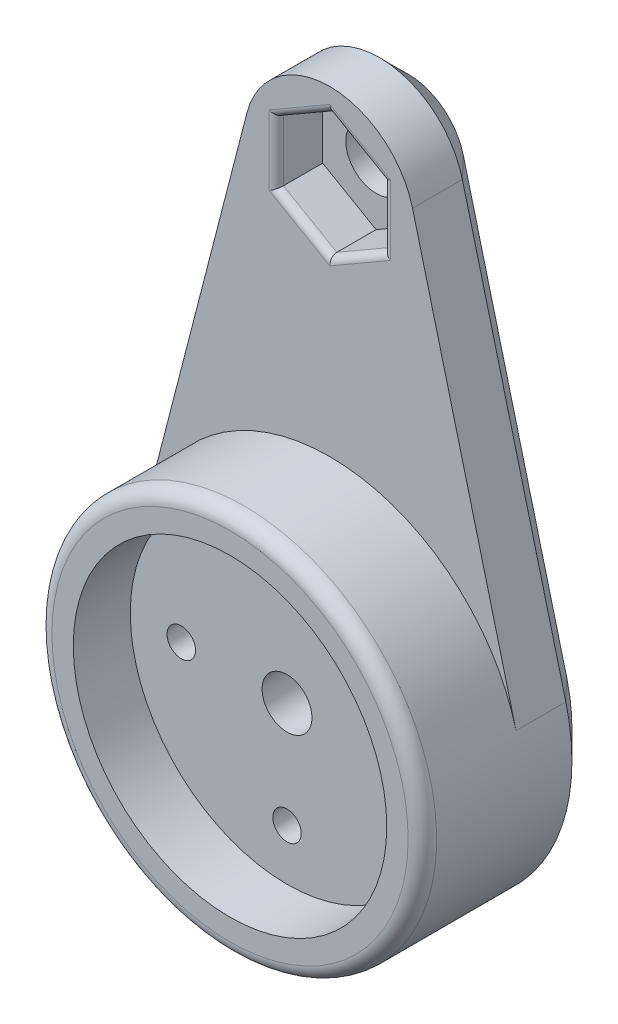
ISO-10303-21;
HEADER;
FILE_DESCRIPTION(('STEP AP214'),'2;1');
FILE_NAME('part.step','',(''),(''),'','','');
FILE_SCHEMA(('AUTOMOTIVE_DESIGN { 1 0 10303 214 1 1 1 1 }'));
ENDSEC;
DATA;
#1=APPLICATION_CONTEXT('core data for automotive mechanical design processes');
#2=APPLICATION_PROTOCOL_DEFINITION('international standard','automotive_design',2000,#1);
#3=PRODUCT_CONTEXT('',#1,'mechanical');
#4=PRODUCT('Part','Part','',(#3));
#5=PRODUCT_RELATED_PRODUCT_CATEGORY('part','',(#4));
#6=PRODUCT_DEFINITION_FORMATION('','',#4);
#7=PRODUCT_DEFINITION_CONTEXT('part definition',#1,'design');
#8=PRODUCT_DEFINITION('design','',#6,#7);
#9=PRODUCT_DEFINITION_SHAPE('','',#8);
#10=(LENGTH_UNIT() NAMED_UNIT(*) SI_UNIT(.MILLI.,.METRE.));
#11=(NAMED_UNIT(*) PLANE_ANGLE_UNIT() SI_UNIT($,.RADIAN.));
#12=(NAMED_UNIT(*) SI_UNIT($,.STERADIAN.) SOLID_ANGLE_UNIT());
#13=UNCERTAINTY_MEASURE_WITH_UNIT(LENGTH_MEASURE(1.E-05),#10,'distance_accuracy_value','');
#14=(GEOMETRIC_REPRESENTATION_CONTEXT(3) GLOBAL_UNCERTAINTY_ASSIGNED_CONTEXT((#13)) GLOBAL_UNIT_ASSIGNED_CONTEXT((#10,
#11,#12)) REPRESENTATION_CONTEXT('',''));
#15=CARTESIAN_POINT('',(0.,0.,0.));
#16=DIRECTION('',(0.,0.,1.));
#17=DIRECTION('',(1.,0.,0.));
#18=AXIS2_PLACEMENT_3D('',#15,#16,#17);
#19=CARTESIAN_POINT('',(0.,30.,-5.5));
#20=DIRECTION('',(0.,0.,1.));
#21=DIRECTION('',(-1.,0.,0.));
#22=AXIS2_PLACEMENT_3D('',#19,#20,#21);
#23=CYLINDRICAL_SURFACE('',#22,2.125);
#24=CARTESIAN_POINT('',(0.,30.,-6.));
#25=DIRECTION('',(0.,0.,1.));
#26=DIRECTION('',(1.,0.,0.));
#27=AXIS2_PLACEMENT_3D('',#24,#25,#26);
#28=CIRCLE('',#27,2.125);
#29=CARTESIAN_POINT('',(2.125,30.,-6.));
#30=VERTEX_POINT('',#29);
#31=EDGE_CURVE('E204',#30,#30,#28,.T.);
#32=ORIENTED_EDGE('',*,*,#31,.F.);
#33=EDGE_LOOP('',(#32));
#34=FACE_BOUND('',#33,.T.);
#35=CARTESIAN_POINT('',(0.,30.,-3.25));
#36=DIRECTION('',(0.,0.,-1.));
#37=DIRECTION('',(-1.,0.,0.));
#38=AXIS2_PLACEMENT_3D('',#35,#36,#37);
#39=CIRCLE('',#38,2.125);
#40=CARTESIAN_POINT('',(-2.125,30.,-3.25));
#41=VERTEX_POINT('',#40);
#42=EDGE_CURVE('E193',#41,#41,#39,.T.);
#43=ORIENTED_EDGE('',*,*,#42,.F.);
#44=EDGE_LOOP('',(#43));
#45=FACE_BOUND('',#44,.T.);
#46=ADVANCED_FACE('F47',(#34,#45),#23,.F.);
#47=CARTESIAN_POINT('',(0.,0.,-5.5));
#48=DIRECTION('',(0.,0.,-1.));
#49=DIRECTION('',(1.,0.,0.));
#50=AXIS2_PLACEMENT_3D('',#47,#48,#49);
#51=PLANE('',#50);
#52=CARTESIAN_POINT('',(0.,-7.42,-5.5));
#53=DIRECTION('',(0.,0.,-1.));
#54=DIRECTION('',(-1.,0.,0.));
#55=AXIS2_PLACEMENT_3D('',#52,#53,#54);
#56=CIRCLE('',#55,1.);
#57=CARTESIAN_POINT('',(-1.,-7.42,-5.5));
#58=VERTEX_POINT('',#57);
#59=EDGE_CURVE('E231',#58,#58,#56,.T.);
#60=ORIENTED_EDGE('',*,*,#59,.F.);
#61=EDGE_LOOP('',(#60));
#62=FACE_BOUND('',#61,.T.);
#63=CARTESIAN_POINT('',(7.42,0.,-5.5));
#64=DIRECTION('',(0.,0.,-1.));
#65=DIRECTION('',(-1.,0.,0.));
#66=AXIS2_PLACEMENT_3D('',#63,#64,#65);
#67=CIRCLE('',#66,1.);
#68=CARTESIAN_POINT('',(6.42,0.,-5.5));
#69=VERTEX_POINT('',#68);
#70=EDGE_CURVE('E232',#69,#69,#67,.T.);
#71=ORIENTED_EDGE('',*,*,#70,.F.);
#72=EDGE_LOOP('',(#71));
#73=FACE_BOUND('',#72,.T.);
#74=CARTESIAN_POINT('',(0.,7.42,-5.5));
#75=DIRECTION('',(0.,0.,-1.));
#76=DIRECTION('',(-1.,0.,0.));
#77=AXIS2_PLACEMENT_3D('',#74,#75,#76);
#78=CIRCLE('',#77,1.);
#79=CARTESIAN_POINT('',(-0.999999999999999,7.42,-5.5));
#80=VERTEX_POINT('',#79);
#81=EDGE_CURVE('E238',#80,#80,#78,.T.);
#82=ORIENTED_EDGE('',*,*,#81,.F.);
#83=EDGE_LOOP('',(#82));
#84=FACE_BOUND('',#83,.T.);
#85=CARTESIAN_POINT('',(-7.42,0.,-5.5));
#86=DIRECTION('',(0.,0.,-1.));
#87=DIRECTION('',(-1.,0.,0.));
#88=AXIS2_PLACEMENT_3D('',#85,#86,#87);
#89=CIRCLE('',#88,1.);
#90=CARTESIAN_POINT('',(-8.42,0.,-5.5));
#91=VERTEX_POINT('',#90);
#92=EDGE_CURVE('E220',#91,#91,#89,.T.);
#93=ORIENTED_EDGE('',*,*,#92,.F.);
#94=EDGE_LOOP('',(#93));
#95=FACE_BOUND('',#94,.T.);
#96=DIRECTION('',(-0.25,-0.968245836551854,0.));
#97=VECTOR('',#96,1.);
#98=CARTESIAN_POINT('',(-11.1348271203463,2.875,-5.5));
#99=LINE('',#98,#97);
#100=CARTESIAN_POINT('',(-3.87298334620741,31.,-5.5));
#101=VERTEX_POINT('',#100);
#102=CARTESIAN_POINT('',(-11.1348271203463,2.875,-5.5));
#103=VERTEX_POINT('',#102);
#104=EDGE_CURVE('E280',#101,#103,#99,.T.);
#105=ORIENTED_EDGE('',*,*,#104,.F.);
#106=CARTESIAN_POINT('',(0.,30.,-5.5));
#107=DIRECTION('',(0.,0.,1.));
#108=DIRECTION('',(1.,0.,0.));
#109=AXIS2_PLACEMENT_3D('',#106,#107,#108);
#110=CIRCLE('',#109,4.);
#111=CARTESIAN_POINT('',(3.87298334620741,31.,-5.5));
#112=VERTEX_POINT('',#111);
#113=EDGE_CURVE('E277',#112,#101,#110,.T.);
#114=ORIENTED_EDGE('',*,*,#113,.F.);
#115=DIRECTION('',(-0.25,0.968245836551854,0.));
#116=VECTOR('',#115,1.);
#117=CARTESIAN_POINT('',(11.1348271203463,2.875,-5.5));
#118=LINE('',#117,#116);
#119=CARTESIAN_POINT('',(11.1348271203463,2.875,-5.5));
#120=VERTEX_POINT('',#119);
#121=EDGE_CURVE('E274',#120,#112,#118,.T.);
#122=ORIENTED_EDGE('',*,*,#121,.F.);
#123=CARTESIAN_POINT('',(0.,0.,-5.5));
#124=DIRECTION('',(0.,0.,1.));
#125=DIRECTION('',(1.,0.,0.));
#126=AXIS2_PLACEMENT_3D('',#123,#124,#125);
#127=CIRCLE('',#126,11.5);
#128=EDGE_CURVE('E283',#103,#120,#127,.T.);
#129=ORIENTED_EDGE('',*,*,#128,.F.);
#130=EDGE_LOOP('',(#105,#114,#122,#129));
#131=FACE_BOUND('',#130,.T.);
#132=CARTESIAN_POINT('',(0.,0.,-5.5));
#133=DIRECTION('',(0.,0.,1.));
#134=DIRECTION('',(1.,0.,0.));
#135=AXIS2_PLACEMENT_3D('',#132,#133,#134);
#136=CIRCLE('',#135,3.);
#137=CARTESIAN_POINT('',(3.,0.,-5.5));
#138=VERTEX_POINT('',#137);
#139=EDGE_CURVE('E211',#138,#138,#136,.T.);
#140=ORIENTED_EDGE('',*,*,#139,.T.);
#141=EDGE_LOOP('',(#140));
#142=FACE_BOUND('',#141,.T.);
#143=CARTESIAN_POINT('',(0.,30.,-5.5));
#144=DIRECTION('',(0.,0.,1.));
#145=DIRECTION('',(1.,0.,0.));
#146=AXIS2_PLACEMENT_3D('',#143,#144,#145);
#147=CIRCLE('',#146,3.);
#148=CARTESIAN_POINT('',(3.,30.,-5.5));
#149=VERTEX_POINT('',#148);
#150=EDGE_CURVE('E207',#149,#149,#147,.T.);
#151=ORIENTED_EDGE('',*,*,#150,.T.);
#152=EDGE_LOOP('',(#151));
#153=FACE_BOUND('',#152,.T.);
#154=ADVANCED_FACE('F416',(#62,#73,#84,#95,#131,#142,#153),#51,.T.);
#155=CARTESIAN_POINT('',(0.,0.,-5.5));
#156=DIRECTION('',(0.,0.,1.));
#157=DIRECTION('',(-1.,0.,0.));
#158=AXIS2_PLACEMENT_3D('',#155,#156,#157);
#159=CYLINDRICAL_SURFACE('',#158,1.75);
#160=CARTESIAN_POINT('',(0.,0.,3.));
#161=DIRECTION('',(0.,0.,-1.));
#162=DIRECTION('',(-1.,0.,0.));
#163=AXIS2_PLACEMENT_3D('',#160,#161,#162);
#164=CIRCLE('',#163,1.75);
#165=CARTESIAN_POINT('',(-1.75,0.,3.));
#166=VERTEX_POINT('',#165);
#167=EDGE_CURVE('E227',#166,#166,#164,.T.);
#168=ORIENTED_EDGE('',*,*,#167,.F.);
#169=EDGE_LOOP('',(#168));
#170=FACE_BOUND('',#169,.T.);
#171=CARTESIAN_POINT('',(0.,0.,-2.5));
#172=DIRECTION('',(0.,0.,1.));
#173=DIRECTION('',(1.,0.,0.));
#174=AXIS2_PLACEMENT_3D('',#171,#172,#173);
#175=CIRCLE('',#174,1.75);
#176=CARTESIAN_POINT('',(1.75,0.,-2.5));
#177=VERTEX_POINT('',#176);
#178=EDGE_CURVE('E217',#177,#177,#175,.F.);
#179=ORIENTED_EDGE('',*,*,#178,.T.);
#180=EDGE_LOOP('',(#179));
#181=FACE_BOUND('',#180,.T.);
#182=ADVANCED_FACE('F382',(#170,#181),#159,.F.);
#183=CARTESIAN_POINT('',(0.,0.,0.));
#184=DIRECTION('',(0.,0.,-1.));
#185=DIRECTION('',(1.,0.,0.));
#186=AXIS2_PLACEMENT_3D('',#183,#184,#185);
#187=PLANE('',#186);
#188=DIRECTION('',(-0.866025403784439,-0.5,0.));
#189=VECTOR('',#188,1.);
#190=CARTESIAN_POINT('',(-10.8653810567666,18.8193920339161,0.));
#191=LINE('',#190,#189);
#192=CARTESIAN_POINT('',(0.,25.0925227118882,0.));
#193=VERTEX_POINT('',#192);
#194=CARTESIAN_POINT('',(4.25,27.5462613559441,0.));
#195=VERTEX_POINT('',#194);
#196=EDGE_CURVE('E328',#193,#195,#191,.F.);
#197=ORIENTED_EDGE('',*,*,#196,.F.);
#198=DIRECTION('',(-0.866025403784438,0.5,0.));
#199=VECTOR('',#198,1.);
#200=CARTESIAN_POINT('',(10.8653810567666,18.8193920339161,0.));
#201=LINE('',#200,#199);
#202=CARTESIAN_POINT('',(-4.25,27.5462613559441,0.));
#203=VERTEX_POINT('',#202);
#204=EDGE_CURVE('E325',#203,#193,#201,.F.);
#205=ORIENTED_EDGE('',*,*,#204,.F.);
#206=DIRECTION('',(0.,1.,0.));
#207=VECTOR('',#206,1.);
#208=CARTESIAN_POINT('',(-4.25,0.,0.));
#209=LINE('',#208,#207);
#210=CARTESIAN_POINT('',(-4.25,32.4537386440559,0.));
#211=VERTEX_POINT('',#210);
#212=EDGE_CURVE('E322',#211,#203,#209,.F.);
#213=ORIENTED_EDGE('',*,*,#212,.F.);
#214=DIRECTION('',(0.866025403784439,0.5,0.));
#215=VECTOR('',#214,1.);
#216=CARTESIAN_POINT('',(-15.1153810567666,26.1806079660839,0.));
#217=LINE('',#216,#215);
#218=CARTESIAN_POINT('',(0.,34.9074772881118,0.));
#219=VERTEX_POINT('',#218);
#220=EDGE_CURVE('E320',#219,#211,#217,.F.);
#221=ORIENTED_EDGE('',*,*,#220,.F.);
#222=DIRECTION('',(0.866025403784439,-0.5,0.));
#223=VECTOR('',#222,1.);
#224=CARTESIAN_POINT('',(15.1153810567666,26.1806079660839,0.));
#225=LINE('',#224,#223);
#226=CARTESIAN_POINT('',(4.25,32.4537386440559,0.));
#227=VERTEX_POINT('',#226);
#228=EDGE_CURVE('E318',#227,#219,#225,.F.);
#229=ORIENTED_EDGE('',*,*,#228,.F.);
#230=DIRECTION('',(0.,-1.,0.));
#231=VECTOR('',#230,1.);
#232=CARTESIAN_POINT('',(4.24999999999999,0.,0.));
#233=LINE('',#232,#231);
#234=EDGE_CURVE('E331',#195,#227,#233,.F.);
#235=ORIENTED_EDGE('',*,*,#234,.F.);
#236=EDGE_LOOP('',(#197,#205,#213,#221,#229,#235));
#237=FACE_BOUND('',#236,.T.);
#238=CARTESIAN_POINT('',(0.,0.,0.));
#239=DIRECTION('',(0.,0.,-1.));
#240=DIRECTION('',(-1.,0.,0.));
#241=AXIS2_PLACEMENT_3D('',#238,#239,#240);
#242=CIRCLE('',#241,13.5);
#243=CARTESIAN_POINT('',(-13.07131879345,3.375,0.));
#244=VERTEX_POINT('',#243);
#245=CARTESIAN_POINT('',(13.07131879345,3.375,0.));
#246=VERTEX_POINT('',#245);
#247=EDGE_CURVE('E252',#244,#246,#242,.T.);
#248=ORIENTED_EDGE('',*,*,#247,.T.);
#249=DIRECTION('',(0.25,-0.968245836551854,0.));
#250=VECTOR('',#249,1.);
#251=CARTESIAN_POINT('',(13.07131879345,3.375,0.));
#252=LINE('',#251,#250);
#253=CARTESIAN_POINT('',(5.80947501931113,31.5,0.));
#254=VERTEX_POINT('',#253);
#255=EDGE_CURVE('E257',#254,#246,#252,.T.);
#256=ORIENTED_EDGE('',*,*,#255,.F.);
#257=CARTESIAN_POINT('',(0.,30.,0.));
#258=DIRECTION('',(0.,0.,1.));
#259=DIRECTION('',(1.,0.,0.));
#260=AXIS2_PLACEMENT_3D('',#257,#258,#259);
#261=CIRCLE('',#260,6.);
#262=CARTESIAN_POINT('',(-5.80947501931113,31.5,0.));
#263=VERTEX_POINT('',#262);
#264=EDGE_CURVE('E260',#254,#263,#261,.T.);
#265=ORIENTED_EDGE('',*,*,#264,.T.);
#266=DIRECTION('',(0.25,0.968245836551854,0.));
#267=VECTOR('',#266,1.);
#268=CARTESIAN_POINT('',(-13.07131879345,3.375,0.));
#269=LINE('',#268,#267);
#270=EDGE_CURVE('E263',#244,#263,#269,.T.);
#271=ORIENTED_EDGE('',*,*,#270,.F.);
#272=EDGE_LOOP('',(#248,#256,#265,#271));
#273=FACE_BOUND('',#272,.T.);
#274=ADVANCED_FACE('F376',(#237,#273),#187,.F.);
#275=CARTESIAN_POINT('',(13.07131879345,3.375,-5.5));
#276=DIRECTION('',(0.968245836551854,0.25,0.));
#277=DIRECTION('',(-0.25,0.968245836551854,0.));
#278=AXIS2_PLACEMENT_3D('',#275,#276,#277);
#279=PLANE('',#278);
#280=DIRECTION('',(0.,0.,1.));
#281=VECTOR('',#280,1.);
#282=CARTESIAN_POINT('',(5.80947501931113,31.5,-5.5));
#283=LINE('',#282,#281);
#284=CARTESIAN_POINT('',(5.80947501931113,31.5,-3.5));
#285=VERTEX_POINT('',#284);
#286=EDGE_CURVE('E272',#285,#254,#283,.T.);
#287=ORIENTED_EDGE('',*,*,#286,.T.);
#288=ORIENTED_EDGE('',*,*,#255,.T.);
#289=DIRECTION('',(0.,0.,1.));
#290=VECTOR('',#289,1.);
#291=CARTESIAN_POINT('',(13.07131879345,3.375,-5.5));
#292=LINE('',#291,#290);
#293=CARTESIAN_POINT('',(13.07131879345,3.375,-3.5));
#294=VERTEX_POINT('',#293);
#295=EDGE_CURVE('E266',#294,#246,#292,.T.);
#296=ORIENTED_EDGE('',*,*,#295,.F.);
#297=DIRECTION('',(0.25,-0.968245836551854,0.));
#298=VECTOR('',#297,1.);
#299=CARTESIAN_POINT('',(13.07131879345,3.375,-3.5));
#300=LINE('',#299,#298);
#301=EDGE_CURVE('E295',#285,#294,#300,.T.);
#302=ORIENTED_EDGE('',*,*,#301,.F.);
#303=EDGE_LOOP('',(#287,#288,#296,#302));
#304=FACE_BOUND('',#303,.T.);
#305=ADVANCED_FACE('F381',(#304),#279,.T.);
#306=CARTESIAN_POINT('',(0.,30.,-5.5));
#307=DIRECTION('',(0.,0.,1.));
#308=DIRECTION('',(-1.,0.,0.));
#309=AXIS2_PLACEMENT_3D('',#306,#307,#308);
#310=CYLINDRICAL_SURFACE('',#309,6.);
#311=DIRECTION('',(0.,0.,1.));
#312=VECTOR('',#311,1.);
#313=CARTESIAN_POINT('',(-5.80947501931113,31.5,-5.5));
#314=LINE('',#313,#312);
#315=CARTESIAN_POINT('',(-5.80947501931113,31.5,-3.5));
#316=VERTEX_POINT('',#315);
#317=EDGE_CURVE('E270',#316,#263,#314,.T.);
#318=ORIENTED_EDGE('',*,*,#317,.T.);
#319=ORIENTED_EDGE('',*,*,#264,.F.);
#320=ORIENTED_EDGE('',*,*,#286,.F.);
#321=CARTESIAN_POINT('',(0.,30.,-3.5));
#322=DIRECTION('',(0.,0.,1.));
#323=DIRECTION('',(1.,0.,0.));
#324=AXIS2_PLACEMENT_3D('',#321,#322,#323);
#325=CIRCLE('',#324,6.);
#326=EDGE_CURVE('E292',#316,#285,#325,.F.);
#327=ORIENTED_EDGE('',*,*,#326,.F.);
#328=EDGE_LOOP('',(#318,#319,#320,#327));
#329=FACE_BOUND('',#328,.T.);
#330=ADVANCED_FACE('F398',(#329),#310,.T.);
#331=CARTESIAN_POINT('',(-13.07131879345,3.375,-5.5));
#332=DIRECTION('',(-0.968245836551854,0.25,0.));
#333=DIRECTION('',(-0.25,-0.968245836551854,0.));
#334=AXIS2_PLACEMENT_3D('',#331,#332,#333);
#335=PLANE('',#334);
#336=DIRECTION('',(0.,0.,1.));
#337=VECTOR('',#336,1.);
#338=CARTESIAN_POINT('',(-13.07131879345,3.375,-5.5));
#339=LINE('',#338,#337);
#340=CARTESIAN_POINT('',(-13.07131879345,3.375,-3.5));
#341=VERTEX_POINT('',#340);
#342=EDGE_CURVE('E268',#341,#244,#339,.T.);
#343=ORIENTED_EDGE('',*,*,#342,.T.);
#344=ORIENTED_EDGE('',*,*,#270,.T.);
#345=ORIENTED_EDGE('',*,*,#317,.F.);
#346=DIRECTION('',(0.25,0.968245836551854,0.));
#347=VECTOR('',#346,1.);
#348=CARTESIAN_POINT('',(-13.07131879345,3.375,-3.5));
#349=LINE('',#348,#347);
#350=EDGE_CURVE('E289',#341,#316,#349,.T.);
#351=ORIENTED_EDGE('',*,*,#350,.F.);
#352=EDGE_LOOP('',(#343,#344,#345,#351));
#353=FACE_BOUND('',#352,.T.);
#354=ADVANCED_FACE('F402',(#353),#335,.T.);
#355=CARTESIAN_POINT('',(0.,0.,-5.5));
#356=DIRECTION('',(0.,0.,1.));
#357=DIRECTION('',(-1.,0.,0.));
#358=AXIS2_PLACEMENT_3D('',#355,#356,#357);
#359=CYLINDRICAL_SURFACE('',#358,13.5);
#360=CARTESIAN_POINT('',(0.,0.,6.));
#361=DIRECTION('',(0.,0.,-1.));
#362=DIRECTION('',(-1.,0.,0.));
#363=AXIS2_PLACEMENT_3D('',#360,#361,#362);
#364=CIRCLE('',#363,13.5);
#365=CARTESIAN_POINT('',(-13.5,0.,6.));
#366=VERTEX_POINT('',#365);
#367=EDGE_CURVE('E310',#366,#366,#364,.F.);
#368=ORIENTED_EDGE('',*,*,#367,.F.);
#369=EDGE_LOOP('',(#368));
#370=FACE_BOUND('',#369,.T.);
#371=ORIENTED_EDGE('',*,*,#295,.T.);
#372=ORIENTED_EDGE('',*,*,#247,.F.);
#373=ORIENTED_EDGE('',*,*,#342,.F.);
#374=CARTESIAN_POINT('',(0.,0.,-3.5));
#375=DIRECTION('',(0.,0.,1.));
#376=DIRECTION('',(1.,0.,0.));
#377=AXIS2_PLACEMENT_3D('',#374,#375,#376);
#378=CIRCLE('',#377,13.5);
#379=EDGE_CURVE('E286',#294,#341,#378,.F.);
#380=ORIENTED_EDGE('',*,*,#379,.F.);
#381=EDGE_LOOP('',(#371,#372,#373,#380));
#382=FACE_BOUND('',#381,.T.);
#383=ADVANCED_FACE('F389',(#370,#382),#359,.T.);
#384=CARTESIAN_POINT('',(0.,0.,7.));
#385=DIRECTION('',(0.,0.,1.));
#386=DIRECTION('',(-1.,0.,0.));
#387=AXIS2_PLACEMENT_3D('',#384,#385,#386);
#388=PLANE('',#387);
#389=CARTESIAN_POINT('',(0.,0.,7.));
#390=DIRECTION('',(0.,0.,-1.));
#391=DIRECTION('',(-1.,0.,0.));
#392=AXIS2_PLACEMENT_3D('',#389,#390,#391);
#393=CIRCLE('',#392,12.5);
#394=CARTESIAN_POINT('',(-12.5,0.,7.));
#395=VERTEX_POINT('',#394);
#396=EDGE_CURVE('E298',#395,#395,#393,.T.);
#397=ORIENTED_EDGE('',*,*,#396,.F.);
#398=EDGE_LOOP('',(#397));
#399=FACE_BOUND('',#398,.T.);
#400=CARTESIAN_POINT('',(0.,0.,7.));
#401=DIRECTION('',(0.,0.,-1.));
#402=DIRECTION('',(-1.,0.,0.));
#403=AXIS2_PLACEMENT_3D('',#400,#401,#402);
#404=CIRCLE('',#403,11.);
#405=CARTESIAN_POINT('',(-11.,0.,7.));
#406=VERTEX_POINT('',#405);
#407=EDGE_CURVE('E223',#406,#406,#404,.T.);
#408=ORIENTED_EDGE('',*,*,#407,.T.);
#409=EDGE_LOOP('',(#408));
#410=FACE_BOUND('',#409,.T.);
#411=ADVANCED_FACE('F547',(#399,#410),#388,.T.);
#412=CARTESIAN_POINT('',(0.,0.,3.));
#413=DIRECTION('',(0.,0.,1.));
#414=DIRECTION('',(-1.,0.,0.));
#415=AXIS2_PLACEMENT_3D('',#412,#413,#414);
#416=CYLINDRICAL_SURFACE('',#415,11.);
#417=CARTESIAN_POINT('',(0.,0.,3.));
#418=DIRECTION('',(0.,0.,-1.));
#419=DIRECTION('',(-1.,0.,0.));
#420=AXIS2_PLACEMENT_3D('',#417,#418,#419);
#421=CIRCLE('',#420,11.);
#422=CARTESIAN_POINT('',(-11.,0.,3.));
#423=VERTEX_POINT('',#422);
#424=EDGE_CURVE('E249',#423,#423,#421,.T.);
#425=ORIENTED_EDGE('',*,*,#424,.T.);
#426=EDGE_LOOP('',(#425));
#427=FACE_BOUND('',#426,.T.);
#428=ORIENTED_EDGE('',*,*,#407,.F.);
#429=EDGE_LOOP('',(#428));
#430=FACE_BOUND('',#429,.T.);
#431=ADVANCED_FACE('F541',(#427,#430),#416,.F.);
#432=CARTESIAN_POINT('',(0.,0.,3.));
#433=DIRECTION('',(0.,0.,1.));
#434=DIRECTION('',(-1.,0.,0.));
#435=AXIS2_PLACEMENT_3D('',#432,#433,#434);
#436=PLANE('',#435);
#437=ORIENTED_EDGE('',*,*,#167,.T.);
#438=EDGE_LOOP('',(#437));
#439=FACE_BOUND('',#438,.T.);
#440=CARTESIAN_POINT('',(-7.42,0.,3.));
#441=DIRECTION('',(0.,0.,-1.));
#442=DIRECTION('',(-1.,0.,0.));
#443=AXIS2_PLACEMENT_3D('',#440,#441,#442);
#444=CIRCLE('',#443,1.);
#445=CARTESIAN_POINT('',(-8.42,0.,3.));
#446=VERTEX_POINT('',#445);
#447=EDGE_CURVE('E224',#446,#446,#444,.T.);
#448=ORIENTED_EDGE('',*,*,#447,.T.);
#449=EDGE_LOOP('',(#448));
#450=FACE_BOUND('',#449,.T.);
#451=CARTESIAN_POINT('',(0.,7.42,3.));
#452=DIRECTION('',(0.,0.,-1.));
#453=DIRECTION('',(-1.,0.,0.));
#454=AXIS2_PLACEMENT_3D('',#451,#452,#453);
#455=CIRCLE('',#454,1.);
#456=CARTESIAN_POINT('',(-0.999999999999999,7.42,3.));
#457=VERTEX_POINT('',#456);
#458=EDGE_CURVE('E235',#457,#457,#455,.T.);
#459=ORIENTED_EDGE('',*,*,#458,.T.);
#460=EDGE_LOOP('',(#459));
#461=FACE_BOUND('',#460,.T.);
#462=CARTESIAN_POINT('',(7.42,0.,3.));
#463=DIRECTION('',(0.,0.,-1.));
#464=DIRECTION('',(-1.,0.,0.));
#465=AXIS2_PLACEMENT_3D('',#462,#463,#464);
#466=CIRCLE('',#465,1.);
#467=CARTESIAN_POINT('',(6.42,0.,3.));
#468=VERTEX_POINT('',#467);
#469=EDGE_CURVE('E228',#468,#468,#466,.T.);
#470=ORIENTED_EDGE('',*,*,#469,.T.);
#471=EDGE_LOOP('',(#470));
#472=FACE_BOUND('',#471,.T.);
#473=CARTESIAN_POINT('',(0.,-7.42,3.));
#474=DIRECTION('',(0.,0.,-1.));
#475=DIRECTION('',(-1.,0.,0.));
#476=AXIS2_PLACEMENT_3D('',#473,#474,#475);
#477=CIRCLE('',#476,1.);
#478=CARTESIAN_POINT('',(-1.,-7.42,3.));
#479=VERTEX_POINT('',#478);
#480=EDGE_CURVE('E244',#479,#479,#477,.T.);
#481=ORIENTED_EDGE('',*,*,#480,.T.);
#482=EDGE_LOOP('',(#481));
#483=FACE_BOUND('',#482,.T.);
#484=ORIENTED_EDGE('',*,*,#424,.F.);
#485=EDGE_LOOP('',(#484));
#486=FACE_BOUND('',#485,.T.);
#487=ADVANCED_FACE('F546',(#439,#450,#461,#472,#483,#486),#436,.T.);
#488=CARTESIAN_POINT('',(0.,-7.42,-5.5));
#489=DIRECTION('',(0.,0.,1.));
#490=DIRECTION('',(-1.,0.,0.));
#491=AXIS2_PLACEMENT_3D('',#488,#489,#490);
#492=CYLINDRICAL_SURFACE('',#491,1.);
#493=ORIENTED_EDGE('',*,*,#59,.T.);
#494=EDGE_LOOP('',(#493));
#495=FACE_BOUND('',#494,.T.);
#496=ORIENTED_EDGE('',*,*,#480,.F.);
#497=EDGE_LOOP('',(#496));
#498=FACE_BOUND('',#497,.T.);
#499=ADVANCED_FACE('F557',(#495,#498),#492,.F.);
#500=CARTESIAN_POINT('',(7.42,0.,-5.5));
#501=DIRECTION('',(0.,0.,1.));
#502=DIRECTION('',(-1.,0.,0.));
#503=AXIS2_PLACEMENT_3D('',#500,#501,#502);
#504=CYLINDRICAL_SURFACE('',#503,1.);
#505=ORIENTED_EDGE('',*,*,#70,.T.);
#506=EDGE_LOOP('',(#505));
#507=FACE_BOUND('',#506,.T.);
#508=ORIENTED_EDGE('',*,*,#469,.F.);
#509=EDGE_LOOP('',(#508));
#510=FACE_BOUND('',#509,.T.);
#511=ADVANCED_FACE('F566',(#507,#510),#504,.F.);
#512=CARTESIAN_POINT('',(0.,7.42,-5.5));
#513=DIRECTION('',(0.,0.,1.));
#514=DIRECTION('',(-1.,0.,0.));
#515=AXIS2_PLACEMENT_3D('',#512,#513,#514);
#516=CYLINDRICAL_SURFACE('',#515,1.);
#517=ORIENTED_EDGE('',*,*,#81,.T.);
#518=EDGE_LOOP('',(#517));
#519=FACE_BOUND('',#518,.T.);
#520=ORIENTED_EDGE('',*,*,#458,.F.);
#521=EDGE_LOOP('',(#520));
#522=FACE_BOUND('',#521,.T.);
#523=ADVANCED_FACE('F575',(#519,#522),#516,.F.);
#524=CARTESIAN_POINT('',(-7.42,0.,-5.5));
#525=DIRECTION('',(0.,0.,1.));
#526=DIRECTION('',(-1.,0.,0.));
#527=AXIS2_PLACEMENT_3D('',#524,#525,#526);
#528=CYLINDRICAL_SURFACE('',#527,1.);
#529=ORIENTED_EDGE('',*,*,#92,.T.);
#530=EDGE_LOOP('',(#529));
#531=FACE_BOUND('',#530,.T.);
#532=ORIENTED_EDGE('',*,*,#447,.F.);
#533=EDGE_LOOP('',(#532));
#534=FACE_BOUND('',#533,.T.);
#535=ADVANCED_FACE('F458',(#531,#534),#528,.F.);
#536=CARTESIAN_POINT('',(0.,30.,-5.5));
#537=DIRECTION('',(0.,0.,1.));
#538=DIRECTION('',(-1.,0.,0.));
#539=AXIS2_PLACEMENT_3D('',#536,#537,#538);
#540=CONICAL_SURFACE('',#539,4.,0.78539816339745);
#541=DIRECTION('',(-0.684653196881459,-0.176776695296638,-0.707106781186547));
#542=VECTOR('',#541,1.);
#543=CARTESIAN_POINT('',(5.80947501931113,31.5,-3.5));
#544=LINE('',#543,#542);
#545=EDGE_CURVE('E303',#285,#112,#544,.T.);
#546=ORIENTED_EDGE('',*,*,#545,.T.);
#547=ORIENTED_EDGE('',*,*,#113,.T.);
#548=DIRECTION('',(-0.684653196881459,0.176776695296637,0.707106781186547));
#549=VECTOR('',#548,1.);
#550=CARTESIAN_POINT('',(-3.87298334620741,31.,-5.5));
#551=LINE('',#550,#549);
#552=EDGE_CURVE('E241',#101,#316,#551,.T.);
#553=ORIENTED_EDGE('',*,*,#552,.T.);
#554=ORIENTED_EDGE('',*,*,#326,.T.);
#555=EDGE_LOOP('',(#546,#547,#553,#554));
#556=FACE_BOUND('',#555,.T.);
#557=ADVANCED_FACE('F414',(#556),#540,.T.);
#558=CARTESIAN_POINT('',(-13.07131879345,3.375,-3.5));
#559=DIRECTION('',(0.684653196881457,-0.176776695296637,0.707106781186549));
#560=DIRECTION('',(0.25,0.968245836551854,0.));
#561=AXIS2_PLACEMENT_3D('',#558,#559,#560);
#562=PLANE('',#561);
#563=ORIENTED_EDGE('',*,*,#552,.F.);
#564=ORIENTED_EDGE('',*,*,#104,.T.);
#565=DIRECTION('',(-0.684653196881459,0.176776695296637,0.707106781186546));
#566=VECTOR('',#565,1.);
#567=CARTESIAN_POINT('',(-11.1348271203463,2.875,-5.5));
#568=LINE('',#567,#566);
#569=EDGE_CURVE('E301',#103,#341,#568,.T.);
#570=ORIENTED_EDGE('',*,*,#569,.T.);
#571=ORIENTED_EDGE('',*,*,#350,.T.);
#572=EDGE_LOOP('',(#563,#564,#570,#571));
#573=FACE_BOUND('',#572,.T.);
#574=ADVANCED_FACE('F404',(#573),#562,.F.);
#575=CARTESIAN_POINT('',(13.07131879345,3.375,-3.5));
#576=DIRECTION('',(-0.684653196881456,-0.176776695296637,0.707106781186549));
#577=DIRECTION('',(0.25,-0.968245836551854,0.));
#578=AXIS2_PLACEMENT_3D('',#575,#576,#577);
#579=PLANE('',#578);
#580=ORIENTED_EDGE('',*,*,#545,.F.);
#581=ORIENTED_EDGE('',*,*,#301,.T.);
#582=DIRECTION('',(-0.684653196881459,-0.176776695296637,-0.707106781186547));
#583=VECTOR('',#582,1.);
#584=CARTESIAN_POINT('',(13.07131879345,3.375,-3.5));
#585=LINE('',#584,#583);
#586=EDGE_CURVE('E299',#294,#120,#585,.T.);
#587=ORIENTED_EDGE('',*,*,#586,.T.);
#588=ORIENTED_EDGE('',*,*,#121,.T.);
#589=EDGE_LOOP('',(#580,#581,#587,#588));
#590=FACE_BOUND('',#589,.T.);
#591=ADVANCED_FACE('F411',(#590),#579,.F.);
#592=CARTESIAN_POINT('',(0.,0.,-5.5));
#593=DIRECTION('',(0.,0.,1.));
#594=DIRECTION('',(-1.,0.,0.));
#595=AXIS2_PLACEMENT_3D('',#592,#593,#594);
#596=CONICAL_SURFACE('',#595,11.5,0.78539816339745);
#597=ORIENTED_EDGE('',*,*,#569,.F.);
#598=ORIENTED_EDGE('',*,*,#128,.T.);
#599=ORIENTED_EDGE('',*,*,#586,.F.);
#600=ORIENTED_EDGE('',*,*,#379,.T.);
#601=EDGE_LOOP('',(#597,#598,#599,#600));
#602=FACE_BOUND('',#601,.T.);
#603=ADVANCED_FACE('F408',(#602),#596,.T.);
#604=CARTESIAN_POINT('',(0.,0.,-2.5));
#605=DIRECTION('',(0.,0.,-1.));
#606=DIRECTION('',(1.,0.,0.));
#607=AXIS2_PLACEMENT_3D('',#604,#605,#606);
#608=PLANE('',#607);
#609=CARTESIAN_POINT('',(0.,0.,-2.5));
#610=DIRECTION('',(0.,0.,1.));
#611=DIRECTION('',(1.,0.,0.));
#612=AXIS2_PLACEMENT_3D('',#609,#610,#611);
#613=CIRCLE('',#612,3.);
#614=CARTESIAN_POINT('',(3.,0.,-2.5));
#615=VERTEX_POINT('',#614);
#616=EDGE_CURVE('E214',#615,#615,#613,.T.);
#617=ORIENTED_EDGE('',*,*,#616,.F.);
#618=EDGE_LOOP('',(#617));
#619=FACE_BOUND('',#618,.T.);
#620=ORIENTED_EDGE('',*,*,#178,.F.);
#621=EDGE_LOOP('',(#620));
#622=FACE_BOUND('',#621,.T.);
#623=ADVANCED_FACE('F451',(#619,#622),#608,.T.);
#624=CARTESIAN_POINT('',(0.,0.,-2.5));
#625=DIRECTION('',(0.,0.,-1.));
#626=DIRECTION('',(1.,0.,0.));
#627=AXIS2_PLACEMENT_3D('',#624,#625,#626);
#628=CYLINDRICAL_SURFACE('',#627,3.);
#629=ORIENTED_EDGE('',*,*,#616,.T.);
#630=EDGE_LOOP('',(#629));
#631=FACE_BOUND('',#630,.T.);
#632=ORIENTED_EDGE('',*,*,#139,.F.);
#633=EDGE_LOOP('',(#632));
#634=FACE_BOUND('',#633,.T.);
#635=ADVANCED_FACE('F461',(#631,#634),#628,.F.);
#636=CARTESIAN_POINT('',(0.,0.,6.));
#637=DIRECTION('',(0.,0.,1.));
#638=DIRECTION('',(-1.,0.,0.));
#639=AXIS2_PLACEMENT_3D('',#636,#637,#638);
#640=TOROIDAL_SURFACE('',#639,12.5,1.);
#641=ORIENTED_EDGE('',*,*,#367,.T.);
#642=EDGE_LOOP('',(#641));
#643=FACE_BOUND('',#642,.T.);
#644=ORIENTED_EDGE('',*,*,#396,.T.);
#645=EDGE_LOOP('',(#644));
#646=FACE_BOUND('',#645,.T.);
#647=ADVANCED_FACE('F435',(#643,#646),#640,.T.);
#648=CARTESIAN_POINT('',(0.,30.,-6.));
#649=DIRECTION('',(0.,0.,-1.));
#650=DIRECTION('',(1.,0.,0.));
#651=AXIS2_PLACEMENT_3D('',#648,#649,#650);
#652=PLANE('',#651);
#653=CARTESIAN_POINT('',(0.,30.,-6.));
#654=DIRECTION('',(0.,0.,1.));
#655=DIRECTION('',(1.,0.,0.));
#656=AXIS2_PLACEMENT_3D('',#653,#654,#655);
#657=CIRCLE('',#656,3.);
#658=CARTESIAN_POINT('',(3.,30.,-6.));
#659=VERTEX_POINT('',#658);
#660=EDGE_CURVE('E208',#659,#659,#657,.T.);
#661=ORIENTED_EDGE('',*,*,#660,.F.);
#662=EDGE_LOOP('',(#661));
#663=FACE_BOUND('',#662,.T.);
#664=ORIENTED_EDGE('',*,*,#31,.T.);
#665=EDGE_LOOP('',(#664));
#666=FACE_BOUND('',#665,.T.);
#667=ADVANCED_FACE('F427',(#663,#666),#652,.T.);
#668=CARTESIAN_POINT('',(0.,30.,-6.));
#669=DIRECTION('',(0.,0.,1.));
#670=DIRECTION('',(-1.,0.,0.));
#671=AXIS2_PLACEMENT_3D('',#668,#669,#670);
#672=CYLINDRICAL_SURFACE('',#671,3.);
#673=ORIENTED_EDGE('',*,*,#660,.T.);
#674=EDGE_LOOP('',(#673));
#675=FACE_BOUND('',#674,.T.);
#676=ORIENTED_EDGE('',*,*,#150,.F.);
#677=EDGE_LOOP('',(#676));
#678=FACE_BOUND('',#677,.T.);
#679=ADVANCED_FACE('F425',(#675,#678),#672,.T.);
#680=CARTESIAN_POINT('',(3.75,27.8349364905389,-3.25));
#681=DIRECTION('',(0.5,-0.866025403784438,0.));
#682=DIRECTION('',(0.866025403784439,0.5,0.));
#683=AXIS2_PLACEMENT_3D('',#680,#681,#682);
#684=PLANE('',#683);
#685=DIRECTION('',(0.,0.,1.));
#686=VECTOR('',#685,1.);
#687=CARTESIAN_POINT('',(3.75,27.8349364905389,-3.25));
#688=LINE('',#687,#686);
#689=CARTESIAN_POINT('',(3.75,27.8349364905389,-3.25));
#690=VERTEX_POINT('',#689);
#691=CARTESIAN_POINT('',(3.75,27.8349364905389,-0.500000000000001));
#692=VERTEX_POINT('',#691);
#693=EDGE_CURVE('E182',#690,#692,#688,.T.);
#694=ORIENTED_EDGE('',*,*,#693,.F.);
#695=DIRECTION('',(-0.866025403784439,-0.5,0.));
#696=VECTOR('',#695,1.);
#697=CARTESIAN_POINT('',(3.75,27.8349364905389,-3.25));
#698=LINE('',#697,#696);
#699=CARTESIAN_POINT('',(0.,25.6698729810778,-3.25));
#700=VERTEX_POINT('',#699);
#701=EDGE_CURVE('E160',#690,#700,#698,.T.);
#702=ORIENTED_EDGE('',*,*,#701,.T.);
#703=DIRECTION('',(0.,0.,1.));
#704=VECTOR('',#703,1.);
#705=CARTESIAN_POINT('',(0.,25.6698729810778,-3.25));
#706=LINE('',#705,#704);
#707=CARTESIAN_POINT('',(0.,25.6698729810778,-0.500000000000001));
#708=VERTEX_POINT('',#707);
#709=EDGE_CURVE('E170',#700,#708,#706,.T.);
#710=ORIENTED_EDGE('',*,*,#709,.T.);
#711=DIRECTION('',(-0.866025403784439,-0.5,0.));
#712=VECTOR('',#711,1.);
#713=CARTESIAN_POINT('',(3.75,27.8349364905389,-0.5));
#714=LINE('',#713,#712);
#715=EDGE_CURVE('E334',#692,#708,#714,.T.);
#716=ORIENTED_EDGE('',*,*,#715,.F.);
#717=EDGE_LOOP('',(#694,#702,#710,#716));
#718=FACE_BOUND('',#717,.T.);
#719=ADVANCED_FACE('F180',(#718),#684,.F.);
#720=CARTESIAN_POINT('',(3.75,32.1650635094611,-3.25));
#721=DIRECTION('',(1.,0.,0.));
#722=DIRECTION('',(0.,1.,0.));
#723=AXIS2_PLACEMENT_3D('',#720,#721,#722);
#724=PLANE('',#723);
#725=DIRECTION('',(0.,0.,1.));
#726=VECTOR('',#725,1.);
#727=CARTESIAN_POINT('',(3.75,32.1650635094611,-3.25));
#728=LINE('',#727,#726);
#729=CARTESIAN_POINT('',(3.75,32.1650635094611,-3.25));
#730=VERTEX_POINT('',#729);
#731=CARTESIAN_POINT('',(3.75,32.1650635094611,-0.500000000000001));
#732=VERTEX_POINT('',#731);
#733=EDGE_CURVE('E194',#730,#732,#728,.T.);
#734=ORIENTED_EDGE('',*,*,#733,.F.);
#735=DIRECTION('',(0.,-1.,0.));
#736=VECTOR('',#735,1.);
#737=CARTESIAN_POINT('',(3.75,32.1650635094611,-3.25));
#738=LINE('',#737,#736);
#739=EDGE_CURVE('E178',#730,#690,#738,.T.);
#740=ORIENTED_EDGE('',*,*,#739,.T.);
#741=ORIENTED_EDGE('',*,*,#693,.T.);
#742=DIRECTION('',(0.,-1.,0.));
#743=VECTOR('',#742,1.);
#744=CARTESIAN_POINT('',(3.75,32.1650635094611,-0.5));
#745=LINE('',#744,#743);
#746=EDGE_CURVE('E313',#732,#692,#745,.T.);
#747=ORIENTED_EDGE('',*,*,#746,.F.);
#748=EDGE_LOOP('',(#734,#740,#741,#747));
#749=FACE_BOUND('',#748,.T.);
#750=ADVANCED_FACE('F368',(#749),#724,.F.);
#751=CARTESIAN_POINT('',(0.,34.3301270189222,-3.25));
#752=DIRECTION('',(0.5,0.866025403784439,0.));
#753=DIRECTION('',(-0.866025403784439,0.5,0.));
#754=AXIS2_PLACEMENT_3D('',#751,#752,#753);
#755=PLANE('',#754);
#756=DIRECTION('',(0.,0.,1.));
#757=VECTOR('',#756,1.);
#758=CARTESIAN_POINT('',(0.,34.3301270189222,-3.25));
#759=LINE('',#758,#757);
#760=CARTESIAN_POINT('',(0.,34.3301270189222,-3.25));
#761=VERTEX_POINT('',#760);
#762=CARTESIAN_POINT('',(0.,34.3301270189222,-0.500000000000001));
#763=VERTEX_POINT('',#762);
#764=EDGE_CURVE('E197',#761,#763,#759,.T.);
#765=ORIENTED_EDGE('',*,*,#764,.F.);
#766=DIRECTION('',(0.866025403784439,-0.5,0.));
#767=VECTOR('',#766,1.);
#768=CARTESIAN_POINT('',(0.,34.3301270189222,-3.25));
#769=LINE('',#768,#767);
#770=EDGE_CURVE('E189',#761,#730,#769,.T.);
#771=ORIENTED_EDGE('',*,*,#770,.T.);
#772=ORIENTED_EDGE('',*,*,#733,.T.);
#773=DIRECTION('',(0.866025403784439,-0.5,0.));
#774=VECTOR('',#773,1.);
#775=CARTESIAN_POINT('',(0.,34.3301270189222,-0.5));
#776=LINE('',#775,#774);
#777=EDGE_CURVE('E11',#763,#732,#776,.T.);
#778=ORIENTED_EDGE('',*,*,#777,.F.);
#779=EDGE_LOOP('',(#765,#771,#772,#778));
#780=FACE_BOUND('',#779,.T.);
#781=ADVANCED_FACE('F363',(#780),#755,.F.);
#782=CARTESIAN_POINT('',(-3.75,32.1650635094611,-3.25));
#783=DIRECTION('',(-0.5,0.866025403784439,0.));
#784=DIRECTION('',(-0.866025403784439,-0.5,0.));
#785=AXIS2_PLACEMENT_3D('',#782,#783,#784);
#786=PLANE('',#785);
#787=DIRECTION('',(0.,0.,1.));
#788=VECTOR('',#787,1.);
#789=CARTESIAN_POINT('',(-3.75,32.1650635094611,-3.25));
#790=LINE('',#789,#788);
#791=CARTESIAN_POINT('',(-3.75,32.1650635094611,-3.25));
#792=VERTEX_POINT('',#791);
#793=CARTESIAN_POINT('',(-3.75,32.1650635094611,-0.500000000000001));
#794=VERTEX_POINT('',#793);
#795=EDGE_CURVE('E200',#792,#794,#790,.T.);
#796=ORIENTED_EDGE('',*,*,#795,.F.);
#797=DIRECTION('',(0.866025403784439,0.5,0.));
#798=VECTOR('',#797,1.);
#799=CARTESIAN_POINT('',(-3.75,32.1650635094611,-3.25));
#800=LINE('',#799,#798);
#801=EDGE_CURVE('E187',#792,#761,#800,.T.);
#802=ORIENTED_EDGE('',*,*,#801,.T.);
#803=ORIENTED_EDGE('',*,*,#764,.T.);
#804=DIRECTION('',(0.866025403784439,0.5,0.));
#805=VECTOR('',#804,1.);
#806=CARTESIAN_POINT('',(-3.75,32.1650635094611,-0.5));
#807=LINE('',#806,#805);
#808=EDGE_CURVE('E56',#794,#763,#807,.T.);
#809=ORIENTED_EDGE('',*,*,#808,.F.);
#810=EDGE_LOOP('',(#796,#802,#803,#809));
#811=FACE_BOUND('',#810,.T.);
#812=ADVANCED_FACE('F357',(#811),#786,.F.);
#813=CARTESIAN_POINT('',(-3.75,27.8349364905389,-3.25));
#814=DIRECTION('',(-1.,0.,0.));
#815=DIRECTION('',(0.,-1.,0.));
#816=AXIS2_PLACEMENT_3D('',#813,#814,#815);
#817=PLANE('',#816);
#818=DIRECTION('',(0.,0.,1.));
#819=VECTOR('',#818,1.);
#820=CARTESIAN_POINT('',(-3.75,27.8349364905389,-3.25));
#821=LINE('',#820,#819);
#822=CARTESIAN_POINT('',(-3.75,27.8349364905389,-3.25));
#823=VERTEX_POINT('',#822);
#824=CARTESIAN_POINT('',(-3.75,27.8349364905389,-0.500000000000001));
#825=VERTEX_POINT('',#824);
#826=EDGE_CURVE('E177',#823,#825,#821,.T.);
#827=ORIENTED_EDGE('',*,*,#826,.F.);
#828=DIRECTION('',(0.,1.,0.));
#829=VECTOR('',#828,1.);
#830=CARTESIAN_POINT('',(-3.75,27.8349364905389,-3.25));
#831=LINE('',#830,#829);
#832=EDGE_CURVE('E163',#823,#792,#831,.T.);
#833=ORIENTED_EDGE('',*,*,#832,.T.);
#834=ORIENTED_EDGE('',*,*,#795,.T.);
#835=DIRECTION('',(0.,1.,0.));
#836=VECTOR('',#835,1.);
#837=CARTESIAN_POINT('',(-3.75,27.8349364905389,-0.5));
#838=LINE('',#837,#836);
#839=EDGE_CURVE('E337',#825,#794,#838,.T.);
#840=ORIENTED_EDGE('',*,*,#839,.F.);
#841=EDGE_LOOP('',(#827,#833,#834,#840));
#842=FACE_BOUND('',#841,.T.);
#843=ADVANCED_FACE('F354',(#842),#817,.F.);
#844=CARTESIAN_POINT('',(0.,25.6698729810778,-3.25));
#845=DIRECTION('',(-0.5,-0.866025403784438,0.));
#846=DIRECTION('',(0.866025403784438,-0.5,0.));
#847=AXIS2_PLACEMENT_3D('',#844,#845,#846);
#848=PLANE('',#847);
#849=ORIENTED_EDGE('',*,*,#709,.F.);
#850=DIRECTION('',(-0.866025403784438,0.5,0.));
#851=VECTOR('',#850,1.);
#852=CARTESIAN_POINT('',(0.,25.6698729810778,-3.25));
#853=LINE('',#852,#851);
#854=EDGE_CURVE('E155',#700,#823,#853,.T.);
#855=ORIENTED_EDGE('',*,*,#854,.T.);
#856=ORIENTED_EDGE('',*,*,#826,.T.);
#857=DIRECTION('',(-0.866025403784438,0.5,0.));
#858=VECTOR('',#857,1.);
#859=CARTESIAN_POINT('',(0.,25.6698729810778,-0.5));
#860=LINE('',#859,#858);
#861=EDGE_CURVE('E173',#708,#825,#860,.T.);
#862=ORIENTED_EDGE('',*,*,#861,.F.);
#863=EDGE_LOOP('',(#849,#855,#856,#862));
#864=FACE_BOUND('',#863,.T.);
#865=ADVANCED_FACE('F171',(#864),#848,.F.);
#866=CARTESIAN_POINT('',(0.,0.,-3.25));
#867=DIRECTION('',(0.,0.,1.));
#868=DIRECTION('',(-1.,0.,0.));
#869=AXIS2_PLACEMENT_3D('',#866,#867,#868);
#870=PLANE('',#869);
#871=ORIENTED_EDGE('',*,*,#42,.T.);
#872=EDGE_LOOP('',(#871));
#873=FACE_BOUND('',#872,.T.);
#874=ORIENTED_EDGE('',*,*,#701,.F.);
#875=ORIENTED_EDGE('',*,*,#739,.F.);
#876=ORIENTED_EDGE('',*,*,#770,.F.);
#877=ORIENTED_EDGE('',*,*,#801,.F.);
#878=ORIENTED_EDGE('',*,*,#832,.F.);
#879=ORIENTED_EDGE('',*,*,#854,.F.);
#880=EDGE_LOOP('',(#874,#875,#876,#877,#878,#879));
#881=FACE_BOUND('',#880,.T.);
#882=ADVANCED_FACE('F157',(#873,#881),#870,.T.);
#883=CARTESIAN_POINT('',(-4.25,27.8349364905389,-0.5));
#884=DIRECTION('',(0.,1.,0.));
#885=DIRECTION('',(-1.,0.,0.));
#886=AXIS2_PLACEMENT_3D('',#883,#884,#885);
#887=CYLINDRICAL_SURFACE('',#886,0.5);
#888=CARTESIAN_POINT('',(-4.25,27.5462613559441,-0.5));
#889=DIRECTION('',(0.5,-0.866025403784439,0.));
#890=DIRECTION('',(-0.866025403784439,-0.5,0.));
#891=AXIS2_PLACEMENT_3D('',#888,#889,#890);
#892=ELLIPSE('',#891,0.577350269189626,0.5);
#893=EDGE_CURVE('E184',#203,#825,#892,.F.);
#894=ORIENTED_EDGE('',*,*,#893,.T.);
#895=ORIENTED_EDGE('',*,*,#839,.T.);
#896=CARTESIAN_POINT('',(-4.25,32.4537386440559,-0.5));
#897=DIRECTION('',(-0.5,-0.866025403784439,0.));
#898=DIRECTION('',(-0.866025403784439,0.5,0.));
#899=AXIS2_PLACEMENT_3D('',#896,#897,#898);
#900=ELLIPSE('',#899,0.577350269189626,0.5);
#901=EDGE_CURVE('E51',#794,#211,#900,.T.);
#902=ORIENTED_EDGE('',*,*,#901,.T.);
#903=ORIENTED_EDGE('',*,*,#212,.T.);
#904=EDGE_LOOP('',(#894,#895,#902,#903));
#905=FACE_BOUND('',#904,.T.);
#906=ADVANCED_FACE('F49',(#905),#887,.T.);
#907=CARTESIAN_POINT('',(-4.,32.5980762113533,-0.5));
#908=DIRECTION('',(0.866025403784439,0.5,0.));
#909=DIRECTION('',(-0.5,0.866025403784439,0.));
#910=AXIS2_PLACEMENT_3D('',#907,#908,#909);
#911=CYLINDRICAL_SURFACE('',#910,0.5);
#912=ORIENTED_EDGE('',*,*,#901,.F.);
#913=ORIENTED_EDGE('',*,*,#808,.T.);
#914=CARTESIAN_POINT('',(0.,34.9074772881118,-0.5));
#915=DIRECTION('',(-1.,0.,0.));
#916=DIRECTION('',(0.,1.,0.));
#917=AXIS2_PLACEMENT_3D('',#914,#915,#916);
#918=ELLIPSE('',#917,0.577350269189626,0.5);
#919=EDGE_CURVE('E63',#763,#219,#918,.T.);
#920=ORIENTED_EDGE('',*,*,#919,.T.);
#921=ORIENTED_EDGE('',*,*,#220,.T.);
#922=EDGE_LOOP('',(#912,#913,#920,#921));
#923=FACE_BOUND('',#922,.T.);
#924=ADVANCED_FACE('F361',(#923),#911,.T.);
#925=CARTESIAN_POINT('',(-0.250000000000001,25.2368602791856,-0.5));
#926=DIRECTION('',(-0.866025403784438,0.5,0.));
#927=DIRECTION('',(-0.5,-0.866025403784438,0.));
#928=AXIS2_PLACEMENT_3D('',#925,#926,#927);
#929=CYLINDRICAL_SURFACE('',#928,0.5);
#930=ORIENTED_EDGE('',*,*,#893,.F.);
#931=ORIENTED_EDGE('',*,*,#204,.T.);
#932=CARTESIAN_POINT('',(0.,25.0925227118882,-0.5));
#933=DIRECTION('',(1.,0.,0.));
#934=DIRECTION('',(0.,-1.,0.));
#935=AXIS2_PLACEMENT_3D('',#932,#933,#934);
#936=ELLIPSE('',#935,0.577350269189626,0.5);
#937=EDGE_CURVE('E344',#193,#708,#936,.F.);
#938=ORIENTED_EDGE('',*,*,#937,.T.);
#939=ORIENTED_EDGE('',*,*,#861,.T.);
#940=EDGE_LOOP('',(#930,#931,#938,#939));
#941=FACE_BOUND('',#940,.T.);
#942=ADVANCED_FACE('F352',(#941),#929,.T.);
#943=CARTESIAN_POINT('',(0.250000000000003,34.7631397208144,-0.5));
#944=DIRECTION('',(0.866025403784439,-0.5,0.));
#945=DIRECTION('',(0.5,0.866025403784439,0.));
#946=AXIS2_PLACEMENT_3D('',#943,#944,#945);
#947=CYLINDRICAL_SURFACE('',#946,0.5);
#948=ORIENTED_EDGE('',*,*,#919,.F.);
#949=ORIENTED_EDGE('',*,*,#777,.T.);
#950=CARTESIAN_POINT('',(4.25,32.4537386440559,-0.5));
#951=DIRECTION('',(-0.5,0.866025403784439,0.));
#952=DIRECTION('',(-0.866025403784439,-0.5,0.));
#953=AXIS2_PLACEMENT_3D('',#950,#951,#952);
#954=ELLIPSE('',#953,0.577350269189626,0.5);
#955=EDGE_CURVE('E342',#732,#227,#954,.T.);
#956=ORIENTED_EDGE('',*,*,#955,.T.);
#957=ORIENTED_EDGE('',*,*,#228,.T.);
#958=EDGE_LOOP('',(#948,#949,#956,#957));
#959=FACE_BOUND('',#958,.T.);
#960=ADVANCED_FACE('F366',(#959),#947,.T.);
#961=CARTESIAN_POINT('',(4.,27.4019237886467,-0.5));
#962=DIRECTION('',(-0.866025403784439,-0.5,0.));
#963=DIRECTION('',(0.5,-0.866025403784438,0.));
#964=AXIS2_PLACEMENT_3D('',#961,#962,#963);
#965=CYLINDRICAL_SURFACE('',#964,0.5);
#966=ORIENTED_EDGE('',*,*,#937,.F.);
#967=ORIENTED_EDGE('',*,*,#196,.T.);
#968=CARTESIAN_POINT('',(4.25,27.5462613559441,-0.5));
#969=DIRECTION('',(0.5,0.866025403784439,0.));
#970=DIRECTION('',(0.866025403784439,-0.5,0.));
#971=AXIS2_PLACEMENT_3D('',#968,#969,#970);
#972=ELLIPSE('',#971,0.577350269189626,0.5);
#973=EDGE_CURVE('E340',#195,#692,#972,.F.);
#974=ORIENTED_EDGE('',*,*,#973,.T.);
#975=ORIENTED_EDGE('',*,*,#715,.T.);
#976=EDGE_LOOP('',(#966,#967,#974,#975));
#977=FACE_BOUND('',#976,.T.);
#978=ADVANCED_FACE('F373',(#977),#965,.T.);
#979=CARTESIAN_POINT('',(4.25,32.1650635094611,-0.5));
#980=DIRECTION('',(0.,-1.,0.));
#981=DIRECTION('',(1.,0.,0.));
#982=AXIS2_PLACEMENT_3D('',#979,#980,#981);
#983=CYLINDRICAL_SURFACE('',#982,0.5);
#984=ORIENTED_EDGE('',*,*,#955,.F.);
#985=ORIENTED_EDGE('',*,*,#746,.T.);
#986=ORIENTED_EDGE('',*,*,#973,.F.);
#987=ORIENTED_EDGE('',*,*,#234,.T.);
#988=EDGE_LOOP('',(#984,#985,#986,#987));
#989=FACE_BOUND('',#988,.T.);
#990=ADVANCED_FACE('F370',(#989),#983,.T.);
#991=CLOSED_SHELL('',(#46,#154,#182,#274,#305,#330,#354,#383,#411,#431,#487,#499,#511,#523,#535,
#557,#574,#591,#603,#623,#635,#647,#667,#679,#719,#750,#781,#812,#843,#865,#882,#906,#924,#942,
#960,#978,#990));
#992=MANIFOLD_SOLID_BREP('B2',#991);
#993=ADVANCED_BREP_SHAPE_REPRESENTATION('',(#18,#992),#14);
#994=SHAPE_DEFINITION_REPRESENTATION(#9,#993);
ENDSEC;
END-ISO-10303-21;
